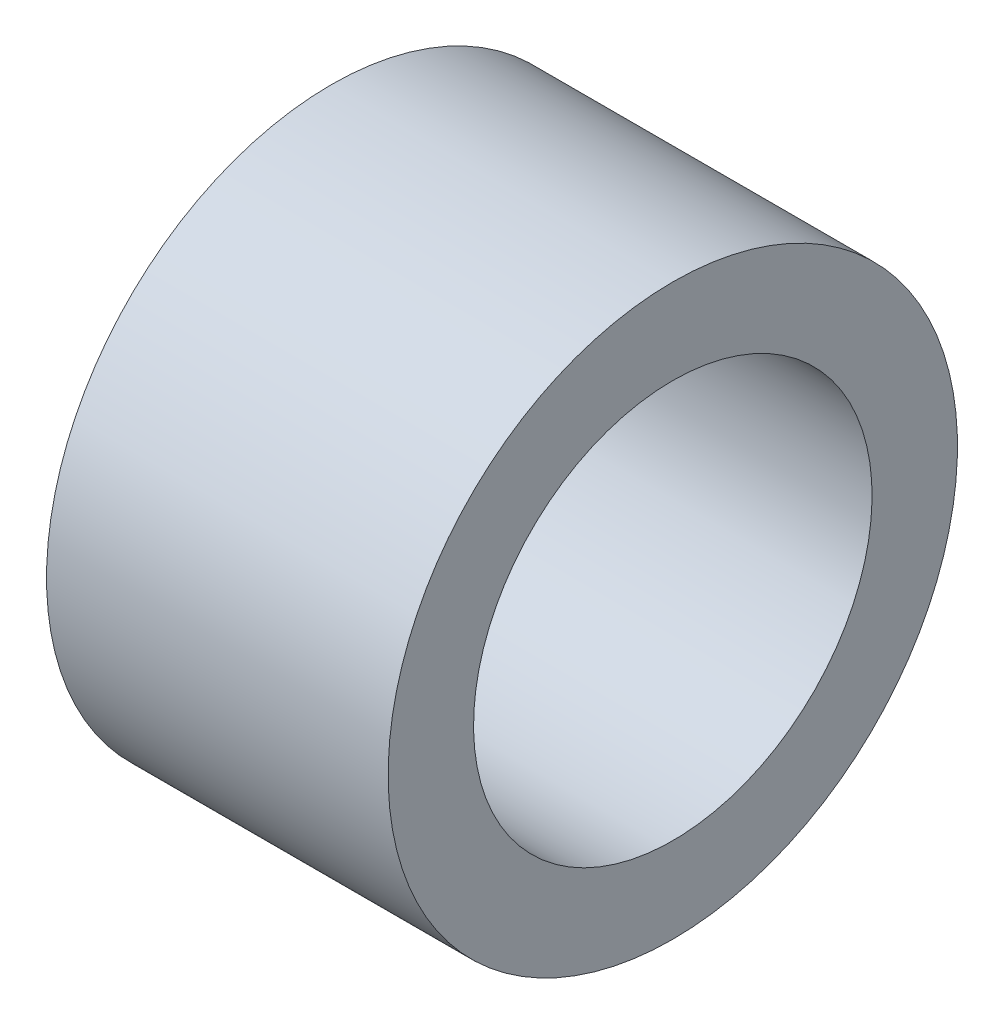
ISO-10303-21;
HEADER;
FILE_DESCRIPTION(('STEP AP214'),'2;1');
FILE_NAME('part.step','',(''),(''),'','','');
FILE_SCHEMA(('AUTOMOTIVE_DESIGN { 1 0 10303 214 1 1 1 1 }'));
ENDSEC;
DATA;
#1=APPLICATION_CONTEXT('core data for automotive mechanical design processes');
#2=APPLICATION_PROTOCOL_DEFINITION('international standard','automotive_design',2000,#1);
#3=PRODUCT_CONTEXT('',#1,'mechanical');
#4=PRODUCT('Part','Part','',(#3));
#5=PRODUCT_RELATED_PRODUCT_CATEGORY('part','',(#4));
#6=PRODUCT_DEFINITION_FORMATION('','',#4);
#7=PRODUCT_DEFINITION_CONTEXT('part definition',#1,'design');
#8=PRODUCT_DEFINITION('design','',#6,#7);
#9=PRODUCT_DEFINITION_SHAPE('','',#8);
#10=(LENGTH_UNIT() NAMED_UNIT(*) SI_UNIT(.MILLI.,.METRE.));
#11=(NAMED_UNIT(*) PLANE_ANGLE_UNIT() SI_UNIT($,.RADIAN.));
#12=(NAMED_UNIT(*) SI_UNIT($,.STERADIAN.) SOLID_ANGLE_UNIT());
#13=UNCERTAINTY_MEASURE_WITH_UNIT(LENGTH_MEASURE(1.E-05),#10,'distance_accuracy_value','');
#14=(GEOMETRIC_REPRESENTATION_CONTEXT(3) GLOBAL_UNCERTAINTY_ASSIGNED_CONTEXT((#13)) GLOBAL_UNIT_ASSIGNED_CONTEXT((#10,
#11,#12)) REPRESENTATION_CONTEXT('',''));
#15=CARTESIAN_POINT('',(0.,0.,0.));
#16=DIRECTION('',(0.,0.,1.));
#17=DIRECTION('',(1.,0.,0.));
#18=AXIS2_PLACEMENT_3D('',#15,#16,#17);
#19=CARTESIAN_POINT('',(-6.,0.,0.));
#20=DIRECTION('',(1.,0.,0.));
#21=DIRECTION('',(0.,1.,0.));
#22=AXIS2_PLACEMENT_3D('',#19,#20,#21);
#23=PLANE('',#22);
#24=CARTESIAN_POINT('',(-6.,0.,0.));
#25=DIRECTION('',(1.,0.,0.));
#26=DIRECTION('',(0.,1.,0.));
#27=AXIS2_PLACEMENT_3D('',#24,#25,#26);
#28=CIRCLE('',#27,10.);
#29=CARTESIAN_POINT('',(-6.,10.,0.));
#30=VERTEX_POINT('',#29);
#31=EDGE_CURVE('E11',#30,#30,#28,.T.);
#32=ORIENTED_EDGE('',*,*,#31,.F.);
#33=EDGE_LOOP('',(#32));
#34=FACE_BOUND('',#33,.T.);
#35=CARTESIAN_POINT('',(-6.,0.,0.));
#36=DIRECTION('',(1.,0.,0.));
#37=DIRECTION('',(0.,1.,0.));
#38=AXIS2_PLACEMENT_3D('',#35,#36,#37);
#39=CIRCLE('',#38,7.);
#40=CARTESIAN_POINT('',(-6.,7.,0.));
#41=VERTEX_POINT('',#40);
#42=EDGE_CURVE('E43',#41,#41,#39,.T.);
#43=ORIENTED_EDGE('',*,*,#42,.T.);
#44=EDGE_LOOP('',(#43));
#45=FACE_BOUND('',#44,.T.);
#46=ADVANCED_FACE('F17',(#34,#45),#23,.F.);
#47=CARTESIAN_POINT('',(6.,0.,0.));
#48=DIRECTION('',(1.,0.,0.));
#49=DIRECTION('',(0.,1.,0.));
#50=AXIS2_PLACEMENT_3D('',#47,#48,#49);
#51=PLANE('',#50);
#52=CARTESIAN_POINT('',(6.,0.,0.));
#53=DIRECTION('',(1.,0.,0.));
#54=DIRECTION('',(0.,1.,0.));
#55=AXIS2_PLACEMENT_3D('',#52,#53,#54);
#56=CIRCLE('',#55,10.);
#57=CARTESIAN_POINT('',(6.,10.,0.));
#58=VERTEX_POINT('',#57);
#59=EDGE_CURVE('E24',#58,#58,#56,.T.);
#60=ORIENTED_EDGE('',*,*,#59,.T.);
#61=EDGE_LOOP('',(#60));
#62=FACE_BOUND('',#61,.T.);
#63=CARTESIAN_POINT('',(6.,0.,0.));
#64=DIRECTION('',(1.,0.,0.));
#65=DIRECTION('',(0.,1.,0.));
#66=AXIS2_PLACEMENT_3D('',#63,#64,#65);
#67=CIRCLE('',#66,7.);
#68=CARTESIAN_POINT('',(6.,7.,0.));
#69=VERTEX_POINT('',#68);
#70=EDGE_CURVE('E39',#69,#69,#67,.T.);
#71=ORIENTED_EDGE('',*,*,#70,.F.);
#72=EDGE_LOOP('',(#71));
#73=FACE_BOUND('',#72,.T.);
#74=ADVANCED_FACE('F50',(#62,#73),#51,.T.);
#75=CARTESIAN_POINT('',(-6.,0.,0.));
#76=DIRECTION('',(1.,0.,0.));
#77=DIRECTION('',(0.,1.,0.));
#78=AXIS2_PLACEMENT_3D('',#75,#76,#77);
#79=CYLINDRICAL_SURFACE('',#78,7.);
#80=ORIENTED_EDGE('',*,*,#70,.T.);
#81=EDGE_LOOP('',(#80));
#82=FACE_BOUND('',#81,.T.);
#83=ORIENTED_EDGE('',*,*,#42,.F.);
#84=EDGE_LOOP('',(#83));
#85=FACE_BOUND('',#84,.T.);
#86=ADVANCED_FACE('F40',(#82,#85),#79,.F.);
#87=CARTESIAN_POINT('',(-6.,0.,0.));
#88=DIRECTION('',(1.,0.,0.));
#89=DIRECTION('',(0.,1.,0.));
#90=AXIS2_PLACEMENT_3D('',#87,#88,#89);
#91=CYLINDRICAL_SURFACE('',#90,10.);
#92=ORIENTED_EDGE('',*,*,#59,.F.);
#93=EDGE_LOOP('',(#92));
#94=FACE_BOUND('',#93,.T.);
#95=ORIENTED_EDGE('',*,*,#31,.T.);
#96=EDGE_LOOP('',(#95));
#97=FACE_BOUND('',#96,.T.);
#98=ADVANCED_FACE('F49',(#94,#97),#91,.T.);
#99=CLOSED_SHELL('',(#46,#74,#86,#98));
#100=MANIFOLD_SOLID_BREP('B1',#99);
#101=ADVANCED_BREP_SHAPE_REPRESENTATION('',(#18,#100),#14);
#102=SHAPE_DEFINITION_REPRESENTATION(#9,#101);
ENDSEC;
END-ISO-10303-21;
